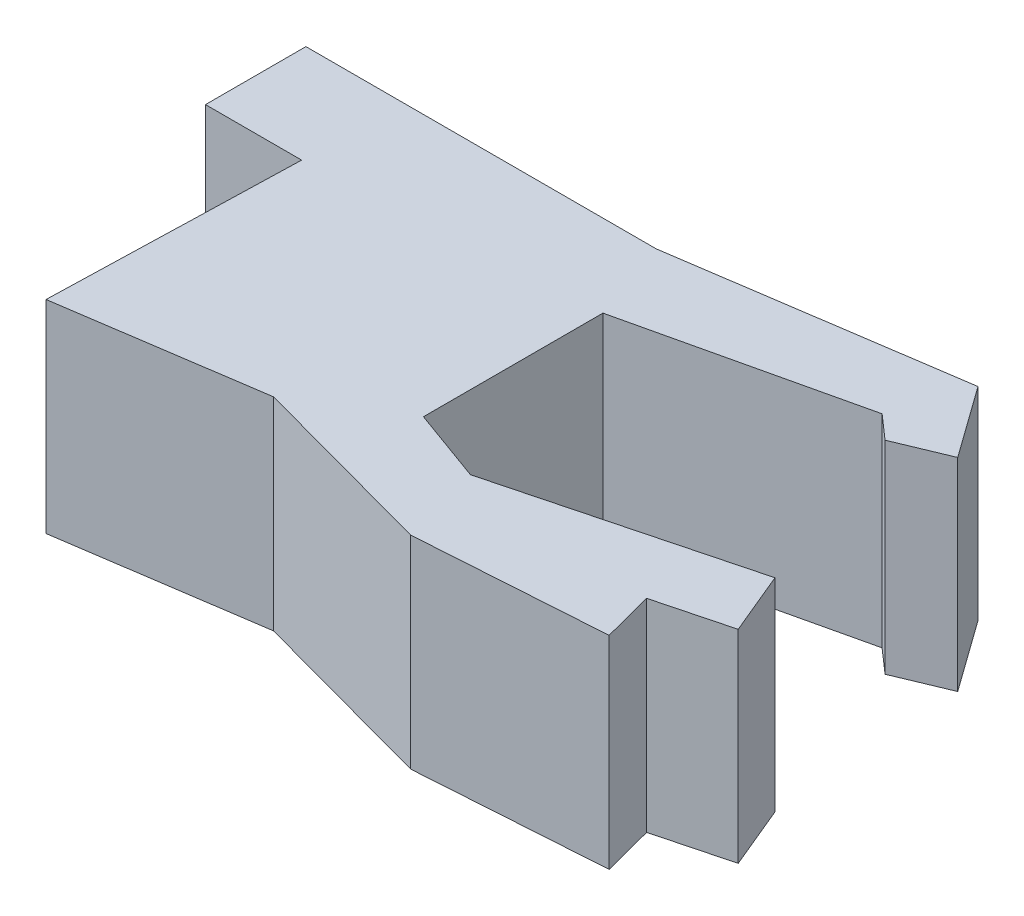
ISO-10303-21;
HEADER;
FILE_DESCRIPTION(('STEP AP214'),'2;1');
FILE_NAME('part.step','',(''),(''),'','','');
FILE_SCHEMA(('AUTOMOTIVE_DESIGN { 1 0 10303 214 1 1 1 1 }'));
ENDSEC;
DATA;
#1=APPLICATION_CONTEXT('core data for automotive mechanical design processes');
#2=APPLICATION_PROTOCOL_DEFINITION('international standard','automotive_design',2000,#1);
#3=PRODUCT_CONTEXT('',#1,'mechanical');
#4=PRODUCT('Part','Part','',(#3));
#5=PRODUCT_RELATED_PRODUCT_CATEGORY('part','',(#4));
#6=PRODUCT_DEFINITION_FORMATION('','',#4);
#7=PRODUCT_DEFINITION_CONTEXT('part definition',#1,'design');
#8=PRODUCT_DEFINITION('design','',#6,#7);
#9=PRODUCT_DEFINITION_SHAPE('','',#8);
#10=(LENGTH_UNIT() NAMED_UNIT(*) SI_UNIT(.MILLI.,.METRE.));
#11=(NAMED_UNIT(*) PLANE_ANGLE_UNIT() SI_UNIT($,.RADIAN.));
#12=(NAMED_UNIT(*) SI_UNIT($,.STERADIAN.) SOLID_ANGLE_UNIT());
#13=UNCERTAINTY_MEASURE_WITH_UNIT(LENGTH_MEASURE(1.E-05),#10,'distance_accuracy_value','');
#14=(GEOMETRIC_REPRESENTATION_CONTEXT(3) GLOBAL_UNCERTAINTY_ASSIGNED_CONTEXT((#13)) GLOBAL_UNIT_ASSIGNED_CONTEXT((#10,
#11,#12)) REPRESENTATION_CONTEXT('',''));
#15=CARTESIAN_POINT('',(0.,0.,0.));
#16=DIRECTION('',(0.,0.,1.));
#17=DIRECTION('',(1.,0.,0.));
#18=AXIS2_PLACEMENT_3D('',#15,#16,#17);
#19=CARTESIAN_POINT('',(-120.893012341814,30.,-39.9916180033261));
#20=DIRECTION('',(1.,0.,0.));
#21=DIRECTION('',(0.,0.,-1.));
#22=AXIS2_PLACEMENT_3D('',#19,#20,#21);
#23=PLANE('',#22);
#24=DIRECTION('',(0.,0.,1.));
#25=VECTOR('',#24,1.);
#26=CARTESIAN_POINT('',(-120.893012341814,0.,-39.9916180033261));
#27=LINE('',#26,#25);
#28=CARTESIAN_POINT('',(-120.893012341814,0.,-54.8555887633079));
#29=VERTEX_POINT('',#28);
#30=CARTESIAN_POINT('',(-120.893012341814,0.,-39.9916180033261));
#31=VERTEX_POINT('',#30);
#32=EDGE_CURVE('E191',#29,#31,#27,.T.);
#33=ORIENTED_EDGE('',*,*,#32,.T.);
#34=DIRECTION('',(0.,-1.,0.));
#35=VECTOR('',#34,1.);
#36=CARTESIAN_POINT('',(-120.893012341814,30.,-39.9916180033261));
#37=LINE('',#36,#35);
#38=CARTESIAN_POINT('',(-120.893012341814,30.,-39.9916180033261));
#39=VERTEX_POINT('',#38);
#40=EDGE_CURVE('E11',#39,#31,#37,.T.);
#41=ORIENTED_EDGE('',*,*,#40,.F.);
#42=DIRECTION('',(0.,0.,1.));
#43=VECTOR('',#42,1.);
#44=CARTESIAN_POINT('',(-120.893012341814,30.,-39.9916180033261));
#45=LINE('',#44,#43);
#46=CARTESIAN_POINT('',(-120.893012341814,30.,-54.8555887633079));
#47=VERTEX_POINT('',#46);
#48=EDGE_CURVE('E225',#47,#39,#45,.T.);
#49=ORIENTED_EDGE('',*,*,#48,.F.);
#50=DIRECTION('',(0.,-1.,0.));
#51=VECTOR('',#50,1.);
#52=CARTESIAN_POINT('',(-120.893012341814,30.,-54.8555887633079));
#53=LINE('',#52,#51);
#54=EDGE_CURVE('E187',#47,#29,#53,.T.);
#55=ORIENTED_EDGE('',*,*,#54,.T.);
#56=EDGE_LOOP('',(#33,#41,#49,#55));
#57=FACE_BOUND('',#56,.T.);
#58=ADVANCED_FACE('F35',(#57),#23,.F.);
#59=CARTESIAN_POINT('',(-106.661550975873,30.,-39.9916180033261));
#60=DIRECTION('',(0.,0.,-1.));
#61=DIRECTION('',(-1.,0.,0.));
#62=AXIS2_PLACEMENT_3D('',#59,#60,#61);
#63=PLANE('',#62);
#64=DIRECTION('',(1.,0.,0.));
#65=VECTOR('',#64,1.);
#66=CARTESIAN_POINT('',(-106.661550975873,0.,-39.9916180033261));
#67=LINE('',#66,#65);
#68=CARTESIAN_POINT('',(-106.661550975873,0.,-39.9916180033261));
#69=VERTEX_POINT('',#68);
#70=EDGE_CURVE('E194',#31,#69,#67,.T.);
#71=ORIENTED_EDGE('',*,*,#70,.T.);
#72=DIRECTION('',(0.,-1.,0.));
#73=VECTOR('',#72,1.);
#74=CARTESIAN_POINT('',(-106.661550975873,30.,-39.9916180033261));
#75=LINE('',#74,#73);
#76=CARTESIAN_POINT('',(-106.661550975873,30.,-39.9916180033261));
#77=VERTEX_POINT('',#76);
#78=EDGE_CURVE('E43',#77,#69,#75,.T.);
#79=ORIENTED_EDGE('',*,*,#78,.F.);
#80=DIRECTION('',(1.,0.,0.));
#81=VECTOR('',#80,1.);
#82=CARTESIAN_POINT('',(-106.661550975873,30.,-39.9916180033261));
#83=LINE('',#82,#81);
#84=EDGE_CURVE('E124',#39,#77,#83,.T.);
#85=ORIENTED_EDGE('',*,*,#84,.F.);
#86=ORIENTED_EDGE('',*,*,#40,.T.);
#87=EDGE_LOOP('',(#71,#79,#85,#86));
#88=FACE_BOUND('',#87,.T.);
#89=ADVANCED_FACE('F333',(#88),#63,.F.);
#90=CARTESIAN_POINT('',(-107.713879475738,30.,-3.21117679368398));
#91=DIRECTION('',(0.999590953890292,0.,0.0285993863692281));
#92=DIRECTION('',(0.0285993863692281,0.,-0.999590953890292));
#93=AXIS2_PLACEMENT_3D('',#90,#91,#92);
#94=PLANE('',#93);
#95=DIRECTION('',(-0.0285993863692281,0.,0.999590953890292));
#96=VECTOR('',#95,1.);
#97=CARTESIAN_POINT('',(-107.713879475738,0.,-3.21117679368398));
#98=LINE('',#97,#96);
#99=CARTESIAN_POINT('',(-107.713879475738,0.,-3.21117679368398));
#100=VERTEX_POINT('',#99);
#101=EDGE_CURVE('E196',#69,#100,#98,.T.);
#102=ORIENTED_EDGE('',*,*,#101,.T.);
#103=DIRECTION('',(0.,-1.,0.));
#104=VECTOR('',#103,1.);
#105=CARTESIAN_POINT('',(-107.713879475738,30.,-3.21117679368398));
#106=LINE('',#105,#104);
#107=CARTESIAN_POINT('',(-107.713879475738,30.,-3.21117679368398));
#108=VERTEX_POINT('',#107);
#109=EDGE_CURVE('E262',#108,#100,#106,.T.);
#110=ORIENTED_EDGE('',*,*,#109,.F.);
#111=DIRECTION('',(-0.0285993863692281,0.,0.999590953890292));
#112=VECTOR('',#111,1.);
#113=CARTESIAN_POINT('',(-107.713879475738,30.,-3.21117679368398));
#114=LINE('',#113,#112);
#115=EDGE_CURVE('E270',#77,#108,#114,.T.);
#116=ORIENTED_EDGE('',*,*,#115,.F.);
#117=ORIENTED_EDGE('',*,*,#78,.T.);
#118=EDGE_LOOP('',(#102,#110,#116,#117));
#119=FACE_BOUND('',#118,.T.);
#120=ADVANCED_FACE('F268',(#119),#94,.F.);
#121=CARTESIAN_POINT('',(-78.4009139290448,30.,-7.57455716132145));
#122=DIRECTION('',(-0.147232722328752,0.,-0.989101878208541));
#123=DIRECTION('',(-0.989101878208542,0.,0.147232722328752));
#124=AXIS2_PLACEMENT_3D('',#121,#122,#123);
#125=PLANE('',#124);
#126=DIRECTION('',(0.989101878208542,0.,-0.147232722328752));
#127=VECTOR('',#126,1.);
#128=CARTESIAN_POINT('',(-78.4009139290448,0.,-7.57455716132145));
#129=LINE('',#128,#127);
#130=CARTESIAN_POINT('',(-78.4009139290448,0.,-7.57455716132145));
#131=VERTEX_POINT('',#130);
#132=EDGE_CURVE('E198',#100,#131,#129,.T.);
#133=ORIENTED_EDGE('',*,*,#132,.T.);
#134=DIRECTION('',(0.,-1.,0.));
#135=VECTOR('',#134,1.);
#136=CARTESIAN_POINT('',(-78.4009139290448,30.,-7.57455716132145));
#137=LINE('',#136,#135);
#138=CARTESIAN_POINT('',(-78.4009139290448,30.,-7.57455716132145));
#139=VERTEX_POINT('',#138);
#140=EDGE_CURVE('E259',#139,#131,#137,.T.);
#141=ORIENTED_EDGE('',*,*,#140,.F.);
#142=DIRECTION('',(0.989101878208542,0.,-0.147232722328752));
#143=VECTOR('',#142,1.);
#144=CARTESIAN_POINT('',(-78.4009139290448,30.,-7.57455716132145));
#145=LINE('',#144,#143);
#146=EDGE_CURVE('E288',#108,#139,#145,.T.);
#147=ORIENTED_EDGE('',*,*,#146,.F.);
#148=ORIENTED_EDGE('',*,*,#109,.T.);
#149=EDGE_LOOP('',(#133,#141,#147,#148));
#150=FACE_BOUND('',#149,.T.);
#151=ADVANCED_FACE('F279',(#150),#125,.F.);
#152=CARTESIAN_POINT('',(-50.5263422546652,30.,0.));
#153=DIRECTION('',(0.262227983922362,0.,-0.965005950472852));
#154=DIRECTION('',(-0.965005950472853,0.,-0.262227983922362));
#155=AXIS2_PLACEMENT_3D('',#152,#153,#154);
#156=PLANE('',#155);
#157=DIRECTION('',(0.965005950472852,0.,0.262227983922362));
#158=VECTOR('',#157,1.);
#159=CARTESIAN_POINT('',(-50.5263422546652,0.,0.));
#160=LINE('',#159,#158);
#161=CARTESIAN_POINT('',(-50.5263422546652,0.,0.));
#162=VERTEX_POINT('',#161);
#163=EDGE_CURVE('E200',#131,#162,#160,.T.);
#164=ORIENTED_EDGE('',*,*,#163,.T.);
#165=DIRECTION('',(0.,-1.,0.));
#166=VECTOR('',#165,1.);
#167=CARTESIAN_POINT('',(-50.5263422546652,30.,0.));
#168=LINE('',#167,#166);
#169=CARTESIAN_POINT('',(-50.5263422546652,30.,0.));
#170=VERTEX_POINT('',#169);
#171=EDGE_CURVE('E256',#170,#162,#168,.T.);
#172=ORIENTED_EDGE('',*,*,#171,.F.);
#173=DIRECTION('',(0.965005950472852,0.,0.262227983922362));
#174=VECTOR('',#173,1.);
#175=CARTESIAN_POINT('',(-50.5263422546652,30.,0.));
#176=LINE('',#175,#174);
#177=EDGE_CURVE('E285',#139,#170,#176,.T.);
#178=ORIENTED_EDGE('',*,*,#177,.F.);
#179=ORIENTED_EDGE('',*,*,#140,.T.);
#180=EDGE_LOOP('',(#164,#172,#178,#179));
#181=FACE_BOUND('',#180,.T.);
#182=ADVANCED_FACE('F283',(#181),#156,.F.);
#183=CARTESIAN_POINT('',(-23.0056245620361,30.,-1.83636151235138));
#184=DIRECTION('',(-0.0665784592076879,0.,-0.997781192832141));
#185=DIRECTION('',(-0.997781192832141,0.,0.0665784592076879));
#186=AXIS2_PLACEMENT_3D('',#183,#184,#185);
#187=PLANE('',#186);
#188=DIRECTION('',(0.997781192832141,0.,-0.0665784592076879));
#189=VECTOR('',#188,1.);
#190=CARTESIAN_POINT('',(-23.0056245620361,0.,-1.83636151235138));
#191=LINE('',#190,#189);
#192=CARTESIAN_POINT('',(-23.0056245620361,0.,-1.83636151235138));
#193=VERTEX_POINT('',#192);
#194=EDGE_CURVE('E202',#162,#193,#191,.T.);
#195=ORIENTED_EDGE('',*,*,#194,.T.);
#196=DIRECTION('',(0.,-1.,0.));
#197=VECTOR('',#196,1.);
#198=CARTESIAN_POINT('',(-23.0056245620361,30.,-1.83636151235138));
#199=LINE('',#198,#197);
#200=CARTESIAN_POINT('',(-23.0056245620361,30.,-1.83636151235138));
#201=VERTEX_POINT('',#200);
#202=EDGE_CURVE('E253',#201,#193,#199,.T.);
#203=ORIENTED_EDGE('',*,*,#202,.F.);
#204=DIRECTION('',(0.997781192832141,0.,-0.0665784592076879));
#205=VECTOR('',#204,1.);
#206=CARTESIAN_POINT('',(-23.0056245620361,30.,-1.83636151235138));
#207=LINE('',#206,#205);
#208=EDGE_CURVE('E287',#170,#201,#207,.T.);
#209=ORIENTED_EDGE('',*,*,#208,.F.);
#210=ORIENTED_EDGE('',*,*,#171,.T.);
#211=EDGE_LOOP('',(#195,#203,#209,#210));
#212=FACE_BOUND('',#211,.T.);
#213=ADVANCED_FACE('F346',(#212),#187,.F.);
#214=CARTESIAN_POINT('',(-24.9686894005679,30.,-9.35589801249001));
#215=DIRECTION('',(-0.967571791662986,0.,0.25259617569963));
#216=DIRECTION('',(0.25259617569963,0.,0.967571791662987));
#217=AXIS2_PLACEMENT_3D('',#214,#215,#216);
#218=PLANE('',#217);
#219=DIRECTION('',(-0.25259617569963,0.,-0.967571791662986));
#220=VECTOR('',#219,1.);
#221=CARTESIAN_POINT('',(-24.9686894005679,0.,-9.35589801249001));
#222=LINE('',#221,#220);
#223=CARTESIAN_POINT('',(-24.9686894005679,0.,-9.35589801249001));
#224=VERTEX_POINT('',#223);
#225=EDGE_CURVE('E204',#193,#224,#222,.T.);
#226=ORIENTED_EDGE('',*,*,#225,.T.);
#227=DIRECTION('',(0.,-1.,0.));
#228=VECTOR('',#227,1.);
#229=CARTESIAN_POINT('',(-24.9686894005679,30.,-9.35589801249001));
#230=LINE('',#229,#228);
#231=CARTESIAN_POINT('',(-24.9686894005679,30.,-9.35589801249001));
#232=VERTEX_POINT('',#231);
#233=EDGE_CURVE('E250',#232,#224,#230,.T.);
#234=ORIENTED_EDGE('',*,*,#233,.F.);
#235=DIRECTION('',(-0.25259617569963,0.,-0.967571791662986));
#236=VECTOR('',#235,1.);
#237=CARTESIAN_POINT('',(-24.9686894005679,30.,-9.35589801249001));
#238=LINE('',#237,#236);
#239=EDGE_CURVE('E290',#201,#232,#238,.T.);
#240=ORIENTED_EDGE('',*,*,#239,.F.);
#241=ORIENTED_EDGE('',*,*,#202,.T.);
#242=EDGE_LOOP('',(#226,#234,#240,#241));
#243=FACE_BOUND('',#242,.T.);
#244=ADVANCED_FACE('F349',(#243),#218,.F.);
#245=CARTESIAN_POINT('',(-14.2229384924753,30.,-12.1612046654876));
#246=DIRECTION('',(-0.252596175699629,0.,-0.967571791662987));
#247=DIRECTION('',(-0.967571791662987,0.,0.252596175699629));
#248=AXIS2_PLACEMENT_3D('',#245,#246,#247);
#249=PLANE('',#248);
#250=DIRECTION('',(0.967571791662987,0.,-0.252596175699629));
#251=VECTOR('',#250,1.);
#252=CARTESIAN_POINT('',(-14.2229384924753,0.,-12.1612046654876));
#253=LINE('',#252,#251);
#254=CARTESIAN_POINT('',(-14.2229384924753,0.,-12.1612046654876));
#255=VERTEX_POINT('',#254);
#256=EDGE_CURVE('E206',#224,#255,#253,.T.);
#257=ORIENTED_EDGE('',*,*,#256,.T.);
#258=DIRECTION('',(0.,-1.,0.));
#259=VECTOR('',#258,1.);
#260=CARTESIAN_POINT('',(-14.2229384924753,30.,-12.1612046654876));
#261=LINE('',#260,#259);
#262=CARTESIAN_POINT('',(-14.2229384924753,30.,-12.1612046654876));
#263=VERTEX_POINT('',#262);
#264=EDGE_CURVE('E247',#263,#255,#261,.T.);
#265=ORIENTED_EDGE('',*,*,#264,.F.);
#266=DIRECTION('',(0.967571791662987,0.,-0.252596175699629));
#267=VECTOR('',#266,1.);
#268=CARTESIAN_POINT('',(-14.2229384924753,30.,-12.1612046654876));
#269=LINE('',#268,#267);
#270=EDGE_CURVE('E296',#232,#263,#269,.T.);
#271=ORIENTED_EDGE('',*,*,#270,.F.);
#272=ORIENTED_EDGE('',*,*,#233,.T.);
#273=EDGE_LOOP('',(#257,#265,#271,#272));
#274=FACE_BOUND('',#273,.T.);
#275=ADVANCED_FACE('F353',(#274),#249,.F.);
#276=CARTESIAN_POINT('',(-18.1102358100238,30.,-21.4907182276039));
#277=DIRECTION('',(-0.923076923076923,0.,0.384615384615385));
#278=DIRECTION('',(0.384615384615385,0.,0.923076923076923));
#279=AXIS2_PLACEMENT_3D('',#276,#277,#278);
#280=PLANE('',#279);
#281=DIRECTION('',(-0.384615384615385,0.,-0.923076923076923));
#282=VECTOR('',#281,1.);
#283=CARTESIAN_POINT('',(-18.1102358100238,0.,-21.4907182276039));
#284=LINE('',#283,#282);
#285=CARTESIAN_POINT('',(-18.1102358100238,0.,-21.4907182276039));
#286=VERTEX_POINT('',#285);
#287=EDGE_CURVE('E208',#255,#286,#284,.T.);
#288=ORIENTED_EDGE('',*,*,#287,.T.);
#289=DIRECTION('',(0.,-1.,0.));
#290=VECTOR('',#289,1.);
#291=CARTESIAN_POINT('',(-18.1102358100238,30.,-21.4907182276039));
#292=LINE('',#291,#290);
#293=CARTESIAN_POINT('',(-18.1102358100238,30.,-21.4907182276039));
#294=VERTEX_POINT('',#293);
#295=EDGE_CURVE('E244',#294,#286,#292,.T.);
#296=ORIENTED_EDGE('',*,*,#295,.F.);
#297=DIRECTION('',(-0.384615384615385,0.,-0.923076923076923));
#298=VECTOR('',#297,1.);
#299=CARTESIAN_POINT('',(-18.1102358100238,30.,-21.4907182276039));
#300=LINE('',#299,#298);
#301=EDGE_CURVE('E298',#263,#294,#300,.T.);
#302=ORIENTED_EDGE('',*,*,#301,.F.);
#303=ORIENTED_EDGE('',*,*,#264,.T.);
#304=EDGE_LOOP('',(#288,#296,#302,#303));
#305=FACE_BOUND('',#304,.T.);
#306=ADVANCED_FACE('F357',(#305),#280,.F.);
#307=CARTESIAN_POINT('',(-53.8470165733845,30.,-12.1612046654876));
#308=DIRECTION('',(0.252596175699629,0.,0.967571791662987));
#309=DIRECTION('',(0.967571791662987,0.,-0.252596175699629));
#310=AXIS2_PLACEMENT_3D('',#307,#308,#309);
#311=PLANE('',#310);
#312=DIRECTION('',(-0.967571791662987,0.,0.252596175699629));
#313=VECTOR('',#312,1.);
#314=CARTESIAN_POINT('',(-53.8470165733845,0.,-12.1612046654876));
#315=LINE('',#314,#313);
#316=CARTESIAN_POINT('',(-53.8470165733845,0.,-12.1612046654876));
#317=VERTEX_POINT('',#316);
#318=EDGE_CURVE('E210',#286,#317,#315,.T.);
#319=ORIENTED_EDGE('',*,*,#318,.T.);
#320=DIRECTION('',(0.,-1.,0.));
#321=VECTOR('',#320,1.);
#322=CARTESIAN_POINT('',(-53.8470165733845,30.,-12.1612046654876));
#323=LINE('',#322,#321);
#324=CARTESIAN_POINT('',(-53.8470165733845,30.,-12.1612046654876));
#325=VERTEX_POINT('',#324);
#326=EDGE_CURVE('E241',#325,#317,#323,.T.);
#327=ORIENTED_EDGE('',*,*,#326,.F.);
#328=DIRECTION('',(-0.967571791662987,0.,0.252596175699629));
#329=VECTOR('',#328,1.);
#330=CARTESIAN_POINT('',(-53.8470165733845,30.,-12.1612046654876));
#331=LINE('',#330,#329);
#332=EDGE_CURVE('E300',#294,#325,#331,.T.);
#333=ORIENTED_EDGE('',*,*,#332,.F.);
#334=ORIENTED_EDGE('',*,*,#295,.T.);
#335=EDGE_LOOP('',(#319,#327,#333,#334));
#336=FACE_BOUND('',#335,.T.);
#337=ADVANCED_FACE('F361',(#336),#311,.F.);
#338=CARTESIAN_POINT('',(-64.7578036206053,30.,-16.1143883782488));
#339=DIRECTION('',(-0.340648777049922,0.,0.940190624657783));
#340=DIRECTION('',(0.940190624657783,0.,0.340648777049922));
#341=AXIS2_PLACEMENT_3D('',#338,#339,#340);
#342=PLANE('',#341);
#343=DIRECTION('',(-0.940190624657783,0.,-0.340648777049922));
#344=VECTOR('',#343,1.);
#345=CARTESIAN_POINT('',(-64.7578036206053,0.,-16.1143883782488));
#346=LINE('',#345,#344);
#347=CARTESIAN_POINT('',(-64.7578036206053,0.,-16.1143883782488));
#348=VERTEX_POINT('',#347);
#349=EDGE_CURVE('E212',#317,#348,#346,.T.);
#350=ORIENTED_EDGE('',*,*,#349,.T.);
#351=DIRECTION('',(0.,-1.,0.));
#352=VECTOR('',#351,1.);
#353=CARTESIAN_POINT('',(-64.7578036206053,30.,-16.1143883782488));
#354=LINE('',#353,#352);
#355=CARTESIAN_POINT('',(-64.7578036206053,30.,-16.1143883782488));
#356=VERTEX_POINT('',#355);
#357=EDGE_CURVE('E238',#356,#348,#354,.T.);
#358=ORIENTED_EDGE('',*,*,#357,.F.);
#359=DIRECTION('',(-0.940190624657783,0.,-0.340648777049922));
#360=VECTOR('',#359,1.);
#361=CARTESIAN_POINT('',(-64.7578036206053,30.,-16.1143883782488));
#362=LINE('',#361,#360);
#363=EDGE_CURVE('E302',#325,#356,#362,.T.);
#364=ORIENTED_EDGE('',*,*,#363,.F.);
#365=ORIENTED_EDGE('',*,*,#326,.T.);
#366=EDGE_LOOP('',(#350,#358,#364,#365));
#367=FACE_BOUND('',#366,.T.);
#368=ADVANCED_FACE('F365',(#367),#342,.F.);
#369=CARTESIAN_POINT('',(-64.7578036206053,30.,-42.6797829280036));
#370=DIRECTION('',(-1.,0.,0.));
#371=DIRECTION('',(0.,0.,1.));
#372=AXIS2_PLACEMENT_3D('',#369,#370,#371);
#373=PLANE('',#372);
#374=DIRECTION('',(0.,0.,-1.));
#375=VECTOR('',#374,1.);
#376=CARTESIAN_POINT('',(-64.7578036206053,0.,-42.6797829280036));
#377=LINE('',#376,#375);
#378=CARTESIAN_POINT('',(-64.7578036206053,0.,-42.6797829280036));
#379=VERTEX_POINT('',#378);
#380=EDGE_CURVE('E214',#348,#379,#377,.T.);
#381=ORIENTED_EDGE('',*,*,#380,.T.);
#382=DIRECTION('',(0.,-1.,0.));
#383=VECTOR('',#382,1.);
#384=CARTESIAN_POINT('',(-64.7578036206053,30.,-42.6797829280036));
#385=LINE('',#384,#383);
#386=CARTESIAN_POINT('',(-64.7578036206053,30.,-42.6797829280036));
#387=VERTEX_POINT('',#386);
#388=EDGE_CURVE('E235',#387,#379,#385,.T.);
#389=ORIENTED_EDGE('',*,*,#388,.F.);
#390=DIRECTION('',(0.,0.,-1.));
#391=VECTOR('',#390,1.);
#392=CARTESIAN_POINT('',(-64.7578036206053,30.,-42.6797829280036));
#393=LINE('',#392,#391);
#394=EDGE_CURVE('E304',#356,#387,#393,.T.);
#395=ORIENTED_EDGE('',*,*,#394,.F.);
#396=ORIENTED_EDGE('',*,*,#357,.T.);
#397=EDGE_LOOP('',(#381,#389,#395,#396));
#398=FACE_BOUND('',#397,.T.);
#399=ADVANCED_FACE('F369',(#398),#373,.F.);
#400=CARTESIAN_POINT('',(-31.1969210591435,30.,-50.4280230050155));
#401=DIRECTION('',(-0.224953805961372,0.,-0.974369429520186));
#402=DIRECTION('',(-0.974369429520186,0.,0.224953805961372));
#403=AXIS2_PLACEMENT_3D('',#400,#401,#402);
#404=PLANE('',#403);
#405=DIRECTION('',(0.974369429520186,0.,-0.224953805961372));
#406=VECTOR('',#405,1.);
#407=CARTESIAN_POINT('',(-31.1969210591435,0.,-50.4280230050155));
#408=LINE('',#407,#406);
#409=CARTESIAN_POINT('',(-31.1969210591435,0.,-50.4280230050155));
#410=VERTEX_POINT('',#409);
#411=EDGE_CURVE('E216',#379,#410,#408,.T.);
#412=ORIENTED_EDGE('',*,*,#411,.T.);
#413=DIRECTION('',(0.,-1.,0.));
#414=VECTOR('',#413,1.);
#415=CARTESIAN_POINT('',(-31.1969210591435,30.,-50.4280230050155));
#416=LINE('',#415,#414);
#417=CARTESIAN_POINT('',(-31.1969210591435,30.,-50.4280230050155));
#418=VERTEX_POINT('',#417);
#419=EDGE_CURVE('E232',#418,#410,#416,.T.);
#420=ORIENTED_EDGE('',*,*,#419,.F.);
#421=DIRECTION('',(0.974369429520186,0.,-0.224953805961372));
#422=VECTOR('',#421,1.);
#423=CARTESIAN_POINT('',(-31.1969210591435,30.,-50.4280230050155));
#424=LINE('',#423,#422);
#425=EDGE_CURVE('E306',#387,#418,#424,.T.);
#426=ORIENTED_EDGE('',*,*,#425,.F.);
#427=ORIENTED_EDGE('',*,*,#388,.T.);
#428=EDGE_LOOP('',(#412,#420,#426,#427));
#429=FACE_BOUND('',#428,.T.);
#430=ADVANCED_FACE('F373',(#429),#404,.F.);
#431=CARTESIAN_POINT('',(-27.5978767206505,30.,-47.2654760348066));
#432=DIRECTION('',(0.660085215475576,0.,-0.751190726986537));
#433=DIRECTION('',(-0.751190726986537,0.,-0.660085215475577));
#434=AXIS2_PLACEMENT_3D('',#431,#432,#433);
#435=PLANE('',#434);
#436=DIRECTION('',(0.751190726986537,0.,0.660085215475577));
#437=VECTOR('',#436,1.);
#438=CARTESIAN_POINT('',(-27.5978767206505,0.,-47.2654760348066));
#439=LINE('',#438,#437);
#440=CARTESIAN_POINT('',(-27.5978767206505,0.,-47.2654760348066));
#441=VERTEX_POINT('',#440);
#442=EDGE_CURVE('E218',#410,#441,#439,.T.);
#443=ORIENTED_EDGE('',*,*,#442,.T.);
#444=DIRECTION('',(0.,-1.,0.));
#445=VECTOR('',#444,1.);
#446=CARTESIAN_POINT('',(-27.5978767206505,30.,-47.2654760348066));
#447=LINE('',#446,#445);
#448=CARTESIAN_POINT('',(-27.5978767206505,30.,-47.2654760348066));
#449=VERTEX_POINT('',#448);
#450=EDGE_CURVE('E229',#449,#441,#447,.T.);
#451=ORIENTED_EDGE('',*,*,#450,.F.);
#452=DIRECTION('',(0.751190726986537,0.,0.660085215475577));
#453=VECTOR('',#452,1.);
#454=CARTESIAN_POINT('',(-27.5978767206505,30.,-47.2654760348066));
#455=LINE('',#454,#453);
#456=EDGE_CURVE('E308',#418,#449,#455,.T.);
#457=ORIENTED_EDGE('',*,*,#456,.F.);
#458=ORIENTED_EDGE('',*,*,#419,.T.);
#459=EDGE_LOOP('',(#443,#451,#457,#458));
#460=FACE_BOUND('',#459,.T.);
#461=ADVANCED_FACE('F314',(#460),#435,.F.);
#462=CARTESIAN_POINT('',(-20.0077639921492,30.,-50.4280230050155));
#463=DIRECTION('',(-0.384615384615385,0.,-0.923076923076923));
#464=DIRECTION('',(-0.923076923076923,0.,0.384615384615385));
#465=AXIS2_PLACEMENT_3D('',#462,#463,#464);
#466=PLANE('',#465);
#467=DIRECTION('',(0.923076923076923,0.,-0.384615384615385));
#468=VECTOR('',#467,1.);
#469=CARTESIAN_POINT('',(-20.0077639921492,0.,-50.4280230050155));
#470=LINE('',#469,#468);
#471=CARTESIAN_POINT('',(-20.0077639921492,0.,-50.4280230050155));
#472=VERTEX_POINT('',#471);
#473=EDGE_CURVE('E220',#441,#472,#470,.T.);
#474=ORIENTED_EDGE('',*,*,#473,.T.);
#475=DIRECTION('',(0.,-1.,0.));
#476=VECTOR('',#475,1.);
#477=CARTESIAN_POINT('',(-20.0077639921492,30.,-50.4280230050155));
#478=LINE('',#477,#476);
#479=CARTESIAN_POINT('',(-20.0077639921492,30.,-50.4280230050155));
#480=VERTEX_POINT('',#479);
#481=EDGE_CURVE('E182',#480,#472,#478,.T.);
#482=ORIENTED_EDGE('',*,*,#481,.F.);
#483=DIRECTION('',(0.923076923076923,0.,-0.384615384615385));
#484=VECTOR('',#483,1.);
#485=CARTESIAN_POINT('',(-20.0077639921492,30.,-50.4280230050155));
#486=LINE('',#485,#484);
#487=EDGE_CURVE('E173',#449,#480,#486,.T.);
#488=ORIENTED_EDGE('',*,*,#487,.F.);
#489=ORIENTED_EDGE('',*,*,#450,.T.);
#490=EDGE_LOOP('',(#474,#482,#488,#489));
#491=FACE_BOUND('',#490,.T.);
#492=ADVANCED_FACE('F318',(#491),#466,.F.);
#493=CARTESIAN_POINT('',(-27.5978767206505,30.,-61.0225553552153));
#494=DIRECTION('',(-0.812912862638725,0.,0.582385334427742));
#495=DIRECTION('',(0.582385334427742,0.,0.812912862638725));
#496=AXIS2_PLACEMENT_3D('',#493,#494,#495);
#497=PLANE('',#496);
#498=DIRECTION('',(-0.582385334427742,0.,-0.812912862638725));
#499=VECTOR('',#498,1.);
#500=CARTESIAN_POINT('',(-27.5978767206505,0.,-61.0225553552153));
#501=LINE('',#500,#499);
#502=CARTESIAN_POINT('',(-27.5978767206505,0.,-61.0225553552153));
#503=VERTEX_POINT('',#502);
#504=EDGE_CURVE('E181',#472,#503,#501,.T.);
#505=ORIENTED_EDGE('',*,*,#504,.T.);
#506=DIRECTION('',(0.,-1.,0.));
#507=VECTOR('',#506,1.);
#508=CARTESIAN_POINT('',(-27.5978767206505,30.,-61.0225553552153));
#509=LINE('',#508,#507);
#510=CARTESIAN_POINT('',(-27.5978767206505,30.,-61.0225553552153));
#511=VERTEX_POINT('',#510);
#512=EDGE_CURVE('E178',#511,#503,#509,.T.);
#513=ORIENTED_EDGE('',*,*,#512,.F.);
#514=DIRECTION('',(-0.582385334427742,0.,-0.812912862638725));
#515=VECTOR('',#514,1.);
#516=CARTESIAN_POINT('',(-27.5978767206505,30.,-61.0225553552153));
#517=LINE('',#516,#515);
#518=EDGE_CURVE('E167',#480,#511,#517,.T.);
#519=ORIENTED_EDGE('',*,*,#518,.F.);
#520=ORIENTED_EDGE('',*,*,#481,.T.);
#521=EDGE_LOOP('',(#505,#513,#519,#520));
#522=FACE_BOUND('',#521,.T.);
#523=ADVANCED_FACE('F179',(#522),#497,.F.);
#524=CARTESIAN_POINT('',(-69.0272420303873,30.,-54.8555887633079));
#525=DIRECTION('',(0.147232722328753,0.,0.989101878208541));
#526=DIRECTION('',(0.989101878208542,0.,-0.147232722328753));
#527=AXIS2_PLACEMENT_3D('',#524,#525,#526);
#528=PLANE('',#527);
#529=DIRECTION('',(-0.989101878208542,0.,0.147232722328753));
#530=VECTOR('',#529,1.);
#531=CARTESIAN_POINT('',(-69.0272420303873,0.,-54.8555887633079));
#532=LINE('',#531,#530);
#533=CARTESIAN_POINT('',(-69.0272420303873,0.,-54.8555887633079));
#534=VERTEX_POINT('',#533);
#535=EDGE_CURVE('E110',#503,#534,#532,.T.);
#536=ORIENTED_EDGE('',*,*,#535,.T.);
#537=DIRECTION('',(0.,-1.,0.));
#538=VECTOR('',#537,1.);
#539=CARTESIAN_POINT('',(-69.0272420303873,30.,-54.8555887633079));
#540=LINE('',#539,#538);
#541=CARTESIAN_POINT('',(-69.0272420303873,30.,-54.8555887633079));
#542=VERTEX_POINT('',#541);
#543=EDGE_CURVE('E183',#542,#534,#540,.T.);
#544=ORIENTED_EDGE('',*,*,#543,.F.);
#545=DIRECTION('',(-0.989101878208542,0.,0.147232722328753));
#546=VECTOR('',#545,1.);
#547=CARTESIAN_POINT('',(-69.0272420303873,30.,-54.8555887633079));
#548=LINE('',#547,#546);
#549=EDGE_CURVE('E171',#511,#542,#548,.T.);
#550=ORIENTED_EDGE('',*,*,#549,.F.);
#551=ORIENTED_EDGE('',*,*,#512,.T.);
#552=EDGE_LOOP('',(#536,#544,#550,#551));
#553=FACE_BOUND('',#552,.T.);
#554=ADVANCED_FACE('F185',(#553),#528,.F.);
#555=CARTESIAN_POINT('',(-120.893012341814,30.,-54.8555887633079));
#556=DIRECTION('',(0.,0.,1.));
#557=DIRECTION('',(1.,0.,0.));
#558=AXIS2_PLACEMENT_3D('',#555,#556,#557);
#559=PLANE('',#558);
#560=DIRECTION('',(-1.,0.,0.));
#561=VECTOR('',#560,1.);
#562=CARTESIAN_POINT('',(-120.893012341814,0.,-54.8555887633079));
#563=LINE('',#562,#561);
#564=EDGE_CURVE('E116',#534,#29,#563,.T.);
#565=ORIENTED_EDGE('',*,*,#564,.T.);
#566=ORIENTED_EDGE('',*,*,#54,.F.);
#567=DIRECTION('',(-1.,0.,0.));
#568=VECTOR('',#567,1.);
#569=CARTESIAN_POINT('',(-120.893012341814,30.,-54.8555887633079));
#570=LINE('',#569,#568);
#571=EDGE_CURVE('E51',#542,#47,#570,.T.);
#572=ORIENTED_EDGE('',*,*,#571,.F.);
#573=ORIENTED_EDGE('',*,*,#543,.T.);
#574=EDGE_LOOP('',(#565,#566,#572,#573));
#575=FACE_BOUND('',#574,.T.);
#576=ADVANCED_FACE('F322',(#575),#559,.F.);
#577=CARTESIAN_POINT('',(0.,30.,0.));
#578=DIRECTION('',(0.,-1.,0.));
#579=DIRECTION('',(0.,0.,-1.));
#580=AXIS2_PLACEMENT_3D('',#577,#578,#579);
#581=PLANE('',#580);
#582=ORIENTED_EDGE('',*,*,#48,.T.);
#583=ORIENTED_EDGE('',*,*,#84,.T.);
#584=ORIENTED_EDGE('',*,*,#115,.T.);
#585=ORIENTED_EDGE('',*,*,#146,.T.);
#586=ORIENTED_EDGE('',*,*,#177,.T.);
#587=ORIENTED_EDGE('',*,*,#208,.T.);
#588=ORIENTED_EDGE('',*,*,#239,.T.);
#589=ORIENTED_EDGE('',*,*,#270,.T.);
#590=ORIENTED_EDGE('',*,*,#301,.T.);
#591=ORIENTED_EDGE('',*,*,#332,.T.);
#592=ORIENTED_EDGE('',*,*,#363,.T.);
#593=ORIENTED_EDGE('',*,*,#394,.T.);
#594=ORIENTED_EDGE('',*,*,#425,.T.);
#595=ORIENTED_EDGE('',*,*,#456,.T.);
#596=ORIENTED_EDGE('',*,*,#487,.T.);
#597=ORIENTED_EDGE('',*,*,#518,.T.);
#598=ORIENTED_EDGE('',*,*,#549,.T.);
#599=ORIENTED_EDGE('',*,*,#571,.T.);
#600=EDGE_LOOP('',(#582,#583,#584,#585,#586,#587,#588,#589,#590,#591,#592,#593,#594,#595,#596,
#597,#598,#599));
#601=FACE_BOUND('',#600,.T.);
#602=ADVANCED_FACE('F169',(#601),#581,.F.);
#603=CARTESIAN_POINT('',(0.,0.,0.));
#604=DIRECTION('',(0.,-1.,0.));
#605=DIRECTION('',(0.,0.,-1.));
#606=AXIS2_PLACEMENT_3D('',#603,#604,#605);
#607=PLANE('',#606);
#608=ORIENTED_EDGE('',*,*,#32,.F.);
#609=ORIENTED_EDGE('',*,*,#564,.F.);
#610=ORIENTED_EDGE('',*,*,#535,.F.);
#611=ORIENTED_EDGE('',*,*,#504,.F.);
#612=ORIENTED_EDGE('',*,*,#473,.F.);
#613=ORIENTED_EDGE('',*,*,#442,.F.);
#614=ORIENTED_EDGE('',*,*,#411,.F.);
#615=ORIENTED_EDGE('',*,*,#380,.F.);
#616=ORIENTED_EDGE('',*,*,#349,.F.);
#617=ORIENTED_EDGE('',*,*,#318,.F.);
#618=ORIENTED_EDGE('',*,*,#287,.F.);
#619=ORIENTED_EDGE('',*,*,#256,.F.);
#620=ORIENTED_EDGE('',*,*,#225,.F.);
#621=ORIENTED_EDGE('',*,*,#194,.F.);
#622=ORIENTED_EDGE('',*,*,#163,.F.);
#623=ORIENTED_EDGE('',*,*,#132,.F.);
#624=ORIENTED_EDGE('',*,*,#101,.F.);
#625=ORIENTED_EDGE('',*,*,#70,.F.);
#626=EDGE_LOOP('',(#608,#609,#610,#611,#612,#613,#614,#615,#616,#617,#618,#619,#620,#621,#622,
#623,#624,#625));
#627=FACE_BOUND('',#626,.T.);
#628=ADVANCED_FACE('F274',(#627),#607,.T.);
#629=CLOSED_SHELL('',(#58,#89,#120,#151,#182,#213,#244,#275,#306,#337,#368,#399,#430,#461,#492,
#523,#554,#576,#602,#628));
#630=MANIFOLD_SOLID_BREP('B2',#629);
#631=ADVANCED_BREP_SHAPE_REPRESENTATION('',(#18,#630),#14);
#632=SHAPE_DEFINITION_REPRESENTATION(#9,#631);
ENDSEC;
END-ISO-10303-21;
